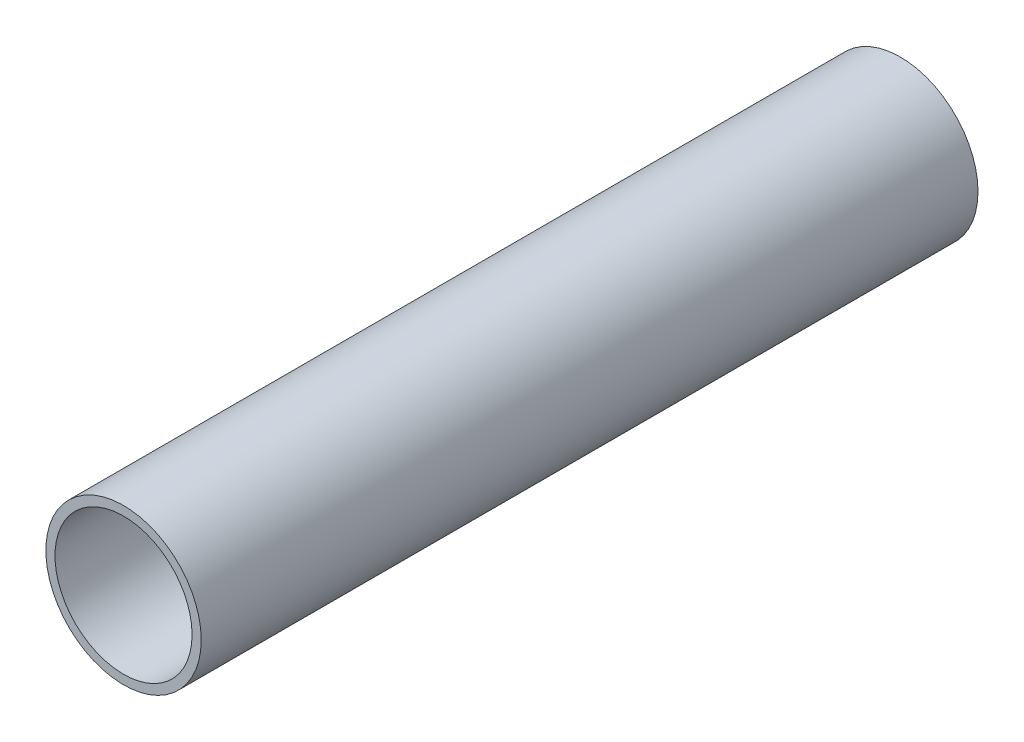
ISO-10303-21;
HEADER;
FILE_DESCRIPTION(('STEP AP214'),'2;1');
FILE_NAME('part.step','',(''),(''),'','','');
FILE_SCHEMA(('AUTOMOTIVE_DESIGN { 1 0 10303 214 1 1 1 1 }'));
ENDSEC;
DATA;
#1=APPLICATION_CONTEXT('core data for automotive mechanical design processes');
#2=APPLICATION_PROTOCOL_DEFINITION('international standard','automotive_design',2000,#1);
#3=PRODUCT_CONTEXT('',#1,'mechanical');
#4=PRODUCT('Part','Part','',(#3));
#5=PRODUCT_RELATED_PRODUCT_CATEGORY('part','',(#4));
#6=PRODUCT_DEFINITION_FORMATION('','',#4);
#7=PRODUCT_DEFINITION_CONTEXT('part definition',#1,'design');
#8=PRODUCT_DEFINITION('design','',#6,#7);
#9=PRODUCT_DEFINITION_SHAPE('','',#8);
#10=(LENGTH_UNIT() NAMED_UNIT(*) SI_UNIT(.MILLI.,.METRE.));
#11=(NAMED_UNIT(*) PLANE_ANGLE_UNIT() SI_UNIT($,.RADIAN.));
#12=(NAMED_UNIT(*) SI_UNIT($,.STERADIAN.) SOLID_ANGLE_UNIT());
#13=UNCERTAINTY_MEASURE_WITH_UNIT(LENGTH_MEASURE(1.E-05),#10,'distance_accuracy_value','');
#14=(GEOMETRIC_REPRESENTATION_CONTEXT(3) GLOBAL_UNCERTAINTY_ASSIGNED_CONTEXT((#13)) GLOBAL_UNIT_ASSIGNED_CONTEXT((#10,
#11,#12)) REPRESENTATION_CONTEXT('',''));
#15=CARTESIAN_POINT('',(0.,0.,0.));
#16=DIRECTION('',(0.,0.,1.));
#17=DIRECTION('',(1.,0.,0.));
#18=AXIS2_PLACEMENT_3D('',#15,#16,#17);
#19=CARTESIAN_POINT('',(0.,0.,85.));
#20=DIRECTION('',(0.,0.,-1.));
#21=DIRECTION('',(-1.,0.,0.));
#22=AXIS2_PLACEMENT_3D('',#19,#20,#21);
#23=CYLINDRICAL_SURFACE('',#22,15.);
#24=CARTESIAN_POINT('',(0.,0.,85.));
#25=DIRECTION('',(0.,0.,1.));
#26=DIRECTION('',(1.,0.,0.));
#27=AXIS2_PLACEMENT_3D('',#24,#25,#26);
#28=CIRCLE('',#27,15.);
#29=CARTESIAN_POINT('',(15.,0.,85.));
#30=VERTEX_POINT('',#29);
#31=EDGE_CURVE('E39',#30,#30,#28,.T.);
#32=ORIENTED_EDGE('',*,*,#31,.T.);
#33=EDGE_LOOP('',(#32));
#34=FACE_BOUND('',#33,.T.);
#35=CARTESIAN_POINT('',(0.,0.,-85.));
#36=DIRECTION('',(0.,0.,1.));
#37=DIRECTION('',(1.,0.,0.));
#38=AXIS2_PLACEMENT_3D('',#35,#36,#37);
#39=CIRCLE('',#38,15.);
#40=CARTESIAN_POINT('',(15.,0.,-85.));
#41=VERTEX_POINT('',#40);
#42=EDGE_CURVE('E45',#41,#41,#39,.T.);
#43=ORIENTED_EDGE('',*,*,#42,.F.);
#44=EDGE_LOOP('',(#43));
#45=FACE_BOUND('',#44,.T.);
#46=ADVANCED_FACE('F32',(#34,#45),#23,.F.);
#47=CARTESIAN_POINT('',(0.,0.,85.));
#48=DIRECTION('',(0.,0.,-1.));
#49=DIRECTION('',(-1.,0.,0.));
#50=AXIS2_PLACEMENT_3D('',#47,#48,#49);
#51=CYLINDRICAL_SURFACE('',#50,17.);
#52=CARTESIAN_POINT('',(0.,0.,85.));
#53=DIRECTION('',(0.,0.,1.));
#54=DIRECTION('',(1.,0.,0.));
#55=AXIS2_PLACEMENT_3D('',#52,#53,#54);
#56=CIRCLE('',#55,17.);
#57=CARTESIAN_POINT('',(17.,0.,85.));
#58=VERTEX_POINT('',#57);
#59=EDGE_CURVE('E10',#58,#58,#56,.T.);
#60=ORIENTED_EDGE('',*,*,#59,.F.);
#61=EDGE_LOOP('',(#60));
#62=FACE_BOUND('',#61,.T.);
#63=CARTESIAN_POINT('',(0.,0.,-85.));
#64=DIRECTION('',(0.,0.,1.));
#65=DIRECTION('',(1.,0.,0.));
#66=AXIS2_PLACEMENT_3D('',#63,#64,#65);
#67=CIRCLE('',#66,17.);
#68=CARTESIAN_POINT('',(17.,0.,-85.));
#69=VERTEX_POINT('',#68);
#70=EDGE_CURVE('E35',#69,#69,#67,.T.);
#71=ORIENTED_EDGE('',*,*,#70,.T.);
#72=EDGE_LOOP('',(#71));
#73=FACE_BOUND('',#72,.T.);
#74=ADVANCED_FACE('F52',(#62,#73),#51,.T.);
#75=CARTESIAN_POINT('',(0.,0.,85.));
#76=DIRECTION('',(0.,0.,1.));
#77=DIRECTION('',(1.,0.,0.));
#78=AXIS2_PLACEMENT_3D('',#75,#76,#77);
#79=PLANE('',#78);
#80=ORIENTED_EDGE('',*,*,#31,.F.);
#81=EDGE_LOOP('',(#80));
#82=FACE_BOUND('',#81,.T.);
#83=ORIENTED_EDGE('',*,*,#59,.T.);
#84=EDGE_LOOP('',(#83));
#85=FACE_BOUND('',#84,.T.);
#86=ADVANCED_FACE('F56',(#82,#85),#79,.T.);
#87=CARTESIAN_POINT('',(0.,0.,-85.));
#88=DIRECTION('',(0.,0.,1.));
#89=DIRECTION('',(1.,0.,0.));
#90=AXIS2_PLACEMENT_3D('',#87,#88,#89);
#91=PLANE('',#90);
#92=ORIENTED_EDGE('',*,*,#42,.T.);
#93=EDGE_LOOP('',(#92));
#94=FACE_BOUND('',#93,.T.);
#95=ORIENTED_EDGE('',*,*,#70,.F.);
#96=EDGE_LOOP('',(#95));
#97=FACE_BOUND('',#96,.T.);
#98=ADVANCED_FACE('F54',(#94,#97),#91,.F.);
#99=CLOSED_SHELL('',(#46,#74,#86,#98));
#100=MANIFOLD_SOLID_BREP('B2',#99);
#101=ADVANCED_BREP_SHAPE_REPRESENTATION('',(#18,#100),#14);
#102=SHAPE_DEFINITION_REPRESENTATION(#9,#101);
ENDSEC;
END-ISO-10303-21;
